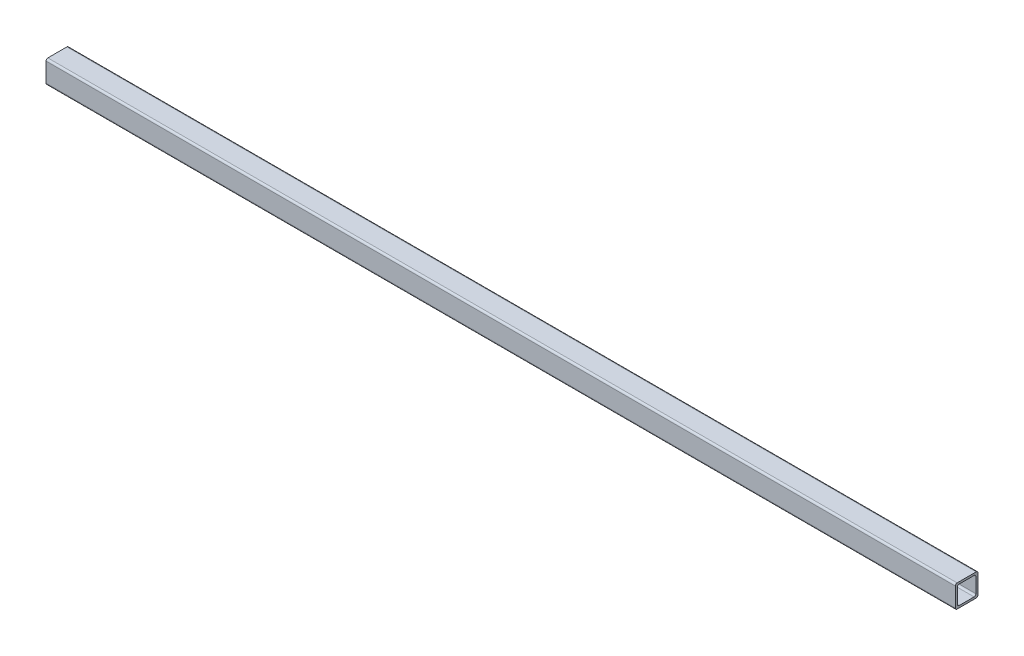
ISO-10303-21;
HEADER;
FILE_DESCRIPTION(('STEP AP214'),'2;1');
FILE_NAME('part.step','',(''),(''),'','','');
FILE_SCHEMA(('AUTOMOTIVE_DESIGN { 1 0 10303 214 1 1 1 1 }'));
ENDSEC;
DATA;
#1=APPLICATION_CONTEXT('core data for automotive mechanical design processes');
#2=APPLICATION_PROTOCOL_DEFINITION('international standard','automotive_design',2000,#1);
#3=PRODUCT_CONTEXT('',#1,'mechanical');
#4=PRODUCT('Part','Part','',(#3));
#5=PRODUCT_RELATED_PRODUCT_CATEGORY('part','',(#4));
#6=PRODUCT_DEFINITION_FORMATION('','',#4);
#7=PRODUCT_DEFINITION_CONTEXT('part definition',#1,'design');
#8=PRODUCT_DEFINITION('design','',#6,#7);
#9=PRODUCT_DEFINITION_SHAPE('','',#8);
#10=(LENGTH_UNIT() NAMED_UNIT(*) SI_UNIT(.MILLI.,.METRE.));
#11=(NAMED_UNIT(*) PLANE_ANGLE_UNIT() SI_UNIT($,.RADIAN.));
#12=(NAMED_UNIT(*) SI_UNIT($,.STERADIAN.) SOLID_ANGLE_UNIT());
#13=UNCERTAINTY_MEASURE_WITH_UNIT(LENGTH_MEASURE(1.E-05),#10,'distance_accuracy_value','');
#14=(GEOMETRIC_REPRESENTATION_CONTEXT(3) GLOBAL_UNCERTAINTY_ASSIGNED_CONTEXT((#13)) GLOBAL_UNIT_ASSIGNED_CONTEXT((#10,
#11,#12)) REPRESENTATION_CONTEXT('',''));
#15=CARTESIAN_POINT('',(0.,0.,0.));
#16=DIRECTION('',(0.,0.,1.));
#17=DIRECTION('',(1.,0.,0.));
#18=AXIS2_PLACEMENT_3D('',#15,#16,#17);
#19=CARTESIAN_POINT('',(500.,25.,12.5));
#20=DIRECTION('',(0.,0.,-1.));
#21=DIRECTION('',(0.,1.,0.));
#22=AXIS2_PLACEMENT_3D('',#19,#20,#21);
#23=PLANE('',#22);
#24=DIRECTION('',(0.,-1.,0.));
#25=VECTOR('',#24,1.);
#26=CARTESIAN_POINT('',(-500.,25.,12.5));
#27=LINE('',#26,#25);
#28=CARTESIAN_POINT('',(-500.,23.,12.5));
#29=VERTEX_POINT('',#28);
#30=CARTESIAN_POINT('',(-500.,2.,12.5));
#31=VERTEX_POINT('',#30);
#32=EDGE_CURVE('E180',#29,#31,#27,.T.);
#33=ORIENTED_EDGE('',*,*,#32,.T.);
#34=DIRECTION('',(-1.,0.,0.));
#35=VECTOR('',#34,1.);
#36=CARTESIAN_POINT('',(500.,2.,12.5));
#37=LINE('',#36,#35);
#38=CARTESIAN_POINT('',(500.,2.,12.5));
#39=VERTEX_POINT('',#38);
#40=EDGE_CURVE('E158',#31,#39,#37,.F.);
#41=ORIENTED_EDGE('',*,*,#40,.T.);
#42=DIRECTION('',(0.,-1.,0.));
#43=VECTOR('',#42,1.);
#44=CARTESIAN_POINT('',(500.,25.,12.5));
#45=LINE('',#44,#43);
#46=CARTESIAN_POINT('',(500.,23.,12.5));
#47=VERTEX_POINT('',#46);
#48=EDGE_CURVE('E191',#47,#39,#45,.T.);
#49=ORIENTED_EDGE('',*,*,#48,.F.);
#50=DIRECTION('',(-1.,0.,0.));
#51=VECTOR('',#50,1.);
#52=CARTESIAN_POINT('',(500.,23.,12.5));
#53=LINE('',#52,#51);
#54=EDGE_CURVE('E163',#47,#29,#53,.T.);
#55=ORIENTED_EDGE('',*,*,#54,.T.);
#56=EDGE_LOOP('',(#33,#41,#49,#55));
#57=FACE_BOUND('',#56,.T.);
#58=ADVANCED_FACE('F39',(#57),#23,.F.);
#59=CARTESIAN_POINT('',(500.,0.,12.5));
#60=DIRECTION('',(0.,1.,0.));
#61=DIRECTION('',(0.,0.,1.));
#62=AXIS2_PLACEMENT_3D('',#59,#60,#61);
#63=PLANE('',#62);
#64=DIRECTION('',(0.,0.,-1.));
#65=VECTOR('',#64,1.);
#66=CARTESIAN_POINT('',(500.,0.,12.5));
#67=LINE('',#66,#65);
#68=CARTESIAN_POINT('',(500.,0.,10.5));
#69=VERTEX_POINT('',#68);
#70=CARTESIAN_POINT('',(500.,0.,-10.5));
#71=VERTEX_POINT('',#70);
#72=EDGE_CURVE('E173',#69,#71,#67,.T.);
#73=ORIENTED_EDGE('',*,*,#72,.F.);
#74=DIRECTION('',(-1.,0.,0.));
#75=VECTOR('',#74,1.);
#76=CARTESIAN_POINT('',(500.,0.,10.5));
#77=LINE('',#76,#75);
#78=CARTESIAN_POINT('',(-500.,0.,10.5));
#79=VERTEX_POINT('',#78);
#80=EDGE_CURVE('E157',#69,#79,#77,.T.);
#81=ORIENTED_EDGE('',*,*,#80,.T.);
#82=DIRECTION('',(0.,0.,-1.));
#83=VECTOR('',#82,1.);
#84=CARTESIAN_POINT('',(-500.,0.,12.5));
#85=LINE('',#84,#83);
#86=CARTESIAN_POINT('',(-500.,0.,-10.5));
#87=VERTEX_POINT('',#86);
#88=EDGE_CURVE('E170',#79,#87,#85,.T.);
#89=ORIENTED_EDGE('',*,*,#88,.T.);
#90=DIRECTION('',(-1.,0.,0.));
#91=VECTOR('',#90,1.);
#92=CARTESIAN_POINT('',(500.,0.,-10.5));
#93=LINE('',#92,#91);
#94=EDGE_CURVE('E175',#87,#71,#93,.F.);
#95=ORIENTED_EDGE('',*,*,#94,.T.);
#96=EDGE_LOOP('',(#73,#81,#89,#95));
#97=FACE_BOUND('',#96,.T.);
#98=ADVANCED_FACE('F169',(#97),#63,.F.);
#99=CARTESIAN_POINT('',(500.,25.,-12.5));
#100=DIRECTION('',(0.,0.,1.));
#101=DIRECTION('',(0.,-1.,0.));
#102=AXIS2_PLACEMENT_3D('',#99,#100,#101);
#103=PLANE('',#102);
#104=DIRECTION('',(0.,1.,0.));
#105=VECTOR('',#104,1.);
#106=CARTESIAN_POINT('',(500.,25.,-12.5));
#107=LINE('',#106,#105);
#108=CARTESIAN_POINT('',(500.,2.,-12.5));
#109=VERTEX_POINT('',#108);
#110=CARTESIAN_POINT('',(500.,23.,-12.5));
#111=VERTEX_POINT('',#110);
#112=EDGE_CURVE('E287',#109,#111,#107,.T.);
#113=ORIENTED_EDGE('',*,*,#112,.F.);
#114=DIRECTION('',(-1.,0.,0.));
#115=VECTOR('',#114,1.);
#116=CARTESIAN_POINT('',(500.,2.,-12.5));
#117=LINE('',#116,#115);
#118=CARTESIAN_POINT('',(-500.,2.,-12.5));
#119=VERTEX_POINT('',#118);
#120=EDGE_CURVE('E211',#109,#119,#117,.T.);
#121=ORIENTED_EDGE('',*,*,#120,.T.);
#122=DIRECTION('',(0.,1.,0.));
#123=VECTOR('',#122,1.);
#124=CARTESIAN_POINT('',(-500.,25.,-12.5));
#125=LINE('',#124,#123);
#126=CARTESIAN_POINT('',(-500.,23.,-12.5));
#127=VERTEX_POINT('',#126);
#128=EDGE_CURVE('E179',#119,#127,#125,.T.);
#129=ORIENTED_EDGE('',*,*,#128,.T.);
#130=DIRECTION('',(-1.,0.,0.));
#131=VECTOR('',#130,1.);
#132=CARTESIAN_POINT('',(500.,23.,-12.5));
#133=LINE('',#132,#131);
#134=EDGE_CURVE('E209',#127,#111,#133,.F.);
#135=ORIENTED_EDGE('',*,*,#134,.T.);
#136=EDGE_LOOP('',(#113,#121,#129,#135));
#137=FACE_BOUND('',#136,.T.);
#138=ADVANCED_FACE('F308',(#137),#103,.F.);
#139=CARTESIAN_POINT('',(500.,25.,12.5));
#140=DIRECTION('',(0.,-1.,0.));
#141=DIRECTION('',(0.,0.,-1.));
#142=AXIS2_PLACEMENT_3D('',#139,#140,#141);
#143=PLANE('',#142);
#144=DIRECTION('',(0.,0.,1.));
#145=VECTOR('',#144,1.);
#146=CARTESIAN_POINT('',(500.,25.,12.5));
#147=LINE('',#146,#145);
#148=CARTESIAN_POINT('',(500.,25.,-10.5));
#149=VERTEX_POINT('',#148);
#150=CARTESIAN_POINT('',(500.,25.,10.5));
#151=VERTEX_POINT('',#150);
#152=EDGE_CURVE('E192',#149,#151,#147,.T.);
#153=ORIENTED_EDGE('',*,*,#152,.F.);
#154=DIRECTION('',(-1.,0.,0.));
#155=VECTOR('',#154,1.);
#156=CARTESIAN_POINT('',(500.,25.,-10.5));
#157=LINE('',#156,#155);
#158=CARTESIAN_POINT('',(-500.,25.,-10.5));
#159=VERTEX_POINT('',#158);
#160=EDGE_CURVE('E216',#149,#159,#157,.T.);
#161=ORIENTED_EDGE('',*,*,#160,.T.);
#162=DIRECTION('',(0.,0.,1.));
#163=VECTOR('',#162,1.);
#164=CARTESIAN_POINT('',(-500.,25.,12.5));
#165=LINE('',#164,#163);
#166=CARTESIAN_POINT('',(-500.,25.,10.5));
#167=VERTEX_POINT('',#166);
#168=EDGE_CURVE('E183',#159,#167,#165,.T.);
#169=ORIENTED_EDGE('',*,*,#168,.T.);
#170=DIRECTION('',(-1.,0.,0.));
#171=VECTOR('',#170,1.);
#172=CARTESIAN_POINT('',(500.,25.,10.5));
#173=LINE('',#172,#171);
#174=EDGE_CURVE('E214',#167,#151,#173,.F.);
#175=ORIENTED_EDGE('',*,*,#174,.T.);
#176=EDGE_LOOP('',(#153,#161,#169,#175));
#177=FACE_BOUND('',#176,.T.);
#178=ADVANCED_FACE('F302',(#177),#143,.F.);
#179=CARTESIAN_POINT('',(500.,0.,0.));
#180=DIRECTION('',(1.,0.,0.));
#181=DIRECTION('',(0.,0.,-1.));
#182=AXIS2_PLACEMENT_3D('',#179,#180,#181);
#183=PLANE('',#182);
#184=DIRECTION('',(0.,0.,1.));
#185=VECTOR('',#184,1.);
#186=CARTESIAN_POINT('',(500.,22.7,0.));
#187=LINE('',#186,#185);
#188=CARTESIAN_POINT('',(500.,22.7,-8.2));
#189=VERTEX_POINT('',#188);
#190=CARTESIAN_POINT('',(500.,22.7,8.19999999999999));
#191=VERTEX_POINT('',#190);
#192=EDGE_CURVE('E185',#189,#191,#187,.T.);
#193=ORIENTED_EDGE('',*,*,#192,.F.);
#194=CARTESIAN_POINT('',(500.,20.7,-8.2));
#195=DIRECTION('',(1.,0.,0.));
#196=DIRECTION('',(0.,0.,-1.));
#197=AXIS2_PLACEMENT_3D('',#194,#195,#196);
#198=CIRCLE('',#197,2.);
#199=CARTESIAN_POINT('',(500.,20.7,-10.2));
#200=VERTEX_POINT('',#199);
#201=EDGE_CURVE('E47',#189,#200,#198,.F.);
#202=ORIENTED_EDGE('',*,*,#201,.T.);
#203=DIRECTION('',(0.,1.,0.));
#204=VECTOR('',#203,1.);
#205=CARTESIAN_POINT('',(500.,0.,-10.2));
#206=LINE('',#205,#204);
#207=CARTESIAN_POINT('',(500.,4.3,-10.2));
#208=VERTEX_POINT('',#207);
#209=EDGE_CURVE('E253',#208,#200,#206,.T.);
#210=ORIENTED_EDGE('',*,*,#209,.F.);
#211=CARTESIAN_POINT('',(500.,4.3,-8.2));
#212=DIRECTION('',(1.,0.,0.));
#213=DIRECTION('',(0.,0.,-1.));
#214=AXIS2_PLACEMENT_3D('',#211,#212,#213);
#215=CIRCLE('',#214,2.);
#216=CARTESIAN_POINT('',(500.,2.3,-8.2));
#217=VERTEX_POINT('',#216);
#218=EDGE_CURVE('E246',#208,#217,#215,.F.);
#219=ORIENTED_EDGE('',*,*,#218,.T.);
#220=DIRECTION('',(0.,0.,-1.));
#221=VECTOR('',#220,1.);
#222=CARTESIAN_POINT('',(500.,2.3,0.));
#223=LINE('',#222,#221);
#224=CARTESIAN_POINT('',(500.,2.3,8.2));
#225=VERTEX_POINT('',#224);
#226=EDGE_CURVE('E259',#225,#217,#223,.T.);
#227=ORIENTED_EDGE('',*,*,#226,.F.);
#228=CARTESIAN_POINT('',(500.,4.3,8.2));
#229=DIRECTION('',(1.,0.,0.));
#230=DIRECTION('',(0.,0.,-1.));
#231=AXIS2_PLACEMENT_3D('',#228,#229,#230);
#232=CIRCLE('',#231,2.);
#233=CARTESIAN_POINT('',(500.,4.3,10.2));
#234=VERTEX_POINT('',#233);
#235=EDGE_CURVE('E238',#225,#234,#232,.F.);
#236=ORIENTED_EDGE('',*,*,#235,.T.);
#237=DIRECTION('',(0.,-1.,0.));
#238=VECTOR('',#237,1.);
#239=CARTESIAN_POINT('',(500.,0.,10.2));
#240=LINE('',#239,#238);
#241=CARTESIAN_POINT('',(500.,20.7,10.2));
#242=VERTEX_POINT('',#241);
#243=EDGE_CURVE('E278',#242,#234,#240,.T.);
#244=ORIENTED_EDGE('',*,*,#243,.F.);
#245=CARTESIAN_POINT('',(500.,20.7,8.19999999999999));
#246=DIRECTION('',(1.,0.,0.));
#247=DIRECTION('',(0.,0.,-1.));
#248=AXIS2_PLACEMENT_3D('',#245,#246,#247);
#249=CIRCLE('',#248,2.);
#250=EDGE_CURVE('E242',#242,#191,#249,.F.);
#251=ORIENTED_EDGE('',*,*,#250,.T.);
#252=EDGE_LOOP('',(#193,#202,#210,#219,#227,#236,#244,#251));
#253=FACE_BOUND('',#252,.T.);
#254=ORIENTED_EDGE('',*,*,#48,.T.);
#255=CARTESIAN_POINT('',(500.,2.,10.5));
#256=DIRECTION('',(1.,0.,0.));
#257=DIRECTION('',(0.,0.,-1.));
#258=AXIS2_PLACEMENT_3D('',#255,#256,#257);
#259=CIRCLE('',#258,2.);
#260=EDGE_CURVE('E207',#39,#69,#259,.T.);
#261=ORIENTED_EDGE('',*,*,#260,.T.);
#262=ORIENTED_EDGE('',*,*,#72,.T.);
#263=CARTESIAN_POINT('',(500.,2.,-10.5));
#264=DIRECTION('',(1.,0.,0.));
#265=DIRECTION('',(0.,0.,-1.));
#266=AXIS2_PLACEMENT_3D('',#263,#264,#265);
#267=CIRCLE('',#266,2.);
#268=EDGE_CURVE('E205',#71,#109,#267,.T.);
#269=ORIENTED_EDGE('',*,*,#268,.T.);
#270=ORIENTED_EDGE('',*,*,#112,.T.);
#271=CARTESIAN_POINT('',(500.,23.,-10.5));
#272=DIRECTION('',(1.,0.,0.));
#273=DIRECTION('',(0.,0.,-1.));
#274=AXIS2_PLACEMENT_3D('',#271,#272,#273);
#275=CIRCLE('',#274,2.);
#276=EDGE_CURVE('E203',#111,#149,#275,.T.);
#277=ORIENTED_EDGE('',*,*,#276,.T.);
#278=ORIENTED_EDGE('',*,*,#152,.T.);
#279=CARTESIAN_POINT('',(500.,23.,10.5));
#280=DIRECTION('',(1.,0.,0.));
#281=DIRECTION('',(0.,0.,-1.));
#282=AXIS2_PLACEMENT_3D('',#279,#280,#281);
#283=CIRCLE('',#282,2.);
#284=EDGE_CURVE('E201',#151,#47,#283,.T.);
#285=ORIENTED_EDGE('',*,*,#284,.T.);
#286=EDGE_LOOP('',(#254,#261,#262,#269,#270,#277,#278,#285));
#287=FACE_BOUND('',#286,.T.);
#288=ADVANCED_FACE('F251',(#253,#287),#183,.T.);
#289=CARTESIAN_POINT('',(-500.,0.,0.));
#290=DIRECTION('',(1.,0.,0.));
#291=DIRECTION('',(0.,0.,-1.));
#292=AXIS2_PLACEMENT_3D('',#289,#290,#291);
#293=PLANE('',#292);
#294=DIRECTION('',(0.,0.,-1.));
#295=VECTOR('',#294,1.);
#296=CARTESIAN_POINT('',(-500.,2.3,10.2));
#297=LINE('',#296,#295);
#298=CARTESIAN_POINT('',(-500.,2.3,8.2));
#299=VERTEX_POINT('',#298);
#300=CARTESIAN_POINT('',(-500.,2.3,-8.2));
#301=VERTEX_POINT('',#300);
#302=EDGE_CURVE('E273',#299,#301,#297,.T.);
#303=ORIENTED_EDGE('',*,*,#302,.T.);
#304=CARTESIAN_POINT('',(-500.,4.3,-8.2));
#305=DIRECTION('',(1.,0.,0.));
#306=DIRECTION('',(0.,0.,-1.));
#307=AXIS2_PLACEMENT_3D('',#304,#305,#306);
#308=CIRCLE('',#307,2.);
#309=CARTESIAN_POINT('',(-500.,4.3,-10.2));
#310=VERTEX_POINT('',#309);
#311=EDGE_CURVE('E61',#301,#310,#308,.T.);
#312=ORIENTED_EDGE('',*,*,#311,.T.);
#313=DIRECTION('',(0.,1.,0.));
#314=VECTOR('',#313,1.);
#315=CARTESIAN_POINT('',(-500.,2.3,-10.2));
#316=LINE('',#315,#314);
#317=CARTESIAN_POINT('',(-500.,20.7,-10.2));
#318=VERTEX_POINT('',#317);
#319=EDGE_CURVE('E266',#310,#318,#316,.T.);
#320=ORIENTED_EDGE('',*,*,#319,.T.);
#321=CARTESIAN_POINT('',(-500.,20.7,-8.2));
#322=DIRECTION('',(1.,0.,0.));
#323=DIRECTION('',(0.,0.,-1.));
#324=AXIS2_PLACEMENT_3D('',#321,#322,#323);
#325=CIRCLE('',#324,2.);
#326=CARTESIAN_POINT('',(-500.,22.7,-8.2));
#327=VERTEX_POINT('',#326);
#328=EDGE_CURVE('E11',#318,#327,#325,.T.);
#329=ORIENTED_EDGE('',*,*,#328,.T.);
#330=DIRECTION('',(0.,0.,1.));
#331=VECTOR('',#330,1.);
#332=CARTESIAN_POINT('',(-500.,22.7,-10.2));
#333=LINE('',#332,#331);
#334=CARTESIAN_POINT('',(-500.,22.7,8.19999999999999));
#335=VERTEX_POINT('',#334);
#336=EDGE_CURVE('E264',#327,#335,#333,.T.);
#337=ORIENTED_EDGE('',*,*,#336,.T.);
#338=CARTESIAN_POINT('',(-500.,20.7,8.19999999999999));
#339=DIRECTION('',(1.,0.,0.));
#340=DIRECTION('',(0.,0.,-1.));
#341=AXIS2_PLACEMENT_3D('',#338,#339,#340);
#342=CIRCLE('',#341,2.);
#343=CARTESIAN_POINT('',(-500.,20.7,10.2));
#344=VERTEX_POINT('',#343);
#345=EDGE_CURVE('E244',#335,#344,#342,.T.);
#346=ORIENTED_EDGE('',*,*,#345,.T.);
#347=DIRECTION('',(0.,-1.,0.));
#348=VECTOR('',#347,1.);
#349=CARTESIAN_POINT('',(-500.,22.7,10.2));
#350=LINE('',#349,#348);
#351=CARTESIAN_POINT('',(-500.,4.3,10.2));
#352=VERTEX_POINT('',#351);
#353=EDGE_CURVE('E270',#344,#352,#350,.T.);
#354=ORIENTED_EDGE('',*,*,#353,.T.);
#355=CARTESIAN_POINT('',(-500.,4.3,8.2));
#356=DIRECTION('',(1.,0.,0.));
#357=DIRECTION('',(0.,0.,-1.));
#358=AXIS2_PLACEMENT_3D('',#355,#356,#357);
#359=CIRCLE('',#358,2.);
#360=EDGE_CURVE('E240',#352,#299,#359,.T.);
#361=ORIENTED_EDGE('',*,*,#360,.T.);
#362=EDGE_LOOP('',(#303,#312,#320,#329,#337,#346,#354,#361));
#363=FACE_BOUND('',#362,.T.);
#364=ORIENTED_EDGE('',*,*,#88,.F.);
#365=CARTESIAN_POINT('',(-500.,2.,10.5));
#366=DIRECTION('',(1.,0.,0.));
#367=DIRECTION('',(0.,0.,-1.));
#368=AXIS2_PLACEMENT_3D('',#365,#366,#367);
#369=CIRCLE('',#368,2.);
#370=EDGE_CURVE('E153',#79,#31,#369,.F.);
#371=ORIENTED_EDGE('',*,*,#370,.T.);
#372=ORIENTED_EDGE('',*,*,#32,.F.);
#373=CARTESIAN_POINT('',(-500.,23.,10.5));
#374=DIRECTION('',(1.,0.,0.));
#375=DIRECTION('',(0.,0.,-1.));
#376=AXIS2_PLACEMENT_3D('',#373,#374,#375);
#377=CIRCLE('',#376,2.);
#378=EDGE_CURVE('E174',#29,#167,#377,.F.);
#379=ORIENTED_EDGE('',*,*,#378,.T.);
#380=ORIENTED_EDGE('',*,*,#168,.F.);
#381=CARTESIAN_POINT('',(-500.,23.,-10.5));
#382=DIRECTION('',(1.,0.,0.));
#383=DIRECTION('',(0.,0.,-1.));
#384=AXIS2_PLACEMENT_3D('',#381,#382,#383);
#385=CIRCLE('',#384,2.);
#386=EDGE_CURVE('E195',#159,#127,#385,.F.);
#387=ORIENTED_EDGE('',*,*,#386,.T.);
#388=ORIENTED_EDGE('',*,*,#128,.F.);
#389=CARTESIAN_POINT('',(-500.,2.,-10.5));
#390=DIRECTION('',(1.,0.,0.));
#391=DIRECTION('',(0.,0.,-1.));
#392=AXIS2_PLACEMENT_3D('',#389,#390,#391);
#393=CIRCLE('',#392,2.);
#394=EDGE_CURVE('E164',#119,#87,#393,.F.);
#395=ORIENTED_EDGE('',*,*,#394,.T.);
#396=EDGE_LOOP('',(#364,#371,#372,#379,#380,#387,#388,#395));
#397=FACE_BOUND('',#396,.T.);
#398=ADVANCED_FACE('F177',(#363,#397),#293,.F.);
#399=CARTESIAN_POINT('',(500.,2.,10.5));
#400=DIRECTION('',(-1.,0.,0.));
#401=DIRECTION('',(0.,0.,1.));
#402=AXIS2_PLACEMENT_3D('',#399,#400,#401);
#403=CYLINDRICAL_SURFACE('',#402,2.);
#404=ORIENTED_EDGE('',*,*,#260,.F.);
#405=ORIENTED_EDGE('',*,*,#40,.F.);
#406=ORIENTED_EDGE('',*,*,#370,.F.);
#407=ORIENTED_EDGE('',*,*,#80,.F.);
#408=EDGE_LOOP('',(#404,#405,#406,#407));
#409=FACE_BOUND('',#408,.T.);
#410=ADVANCED_FACE('F156',(#409),#403,.T.);
#411=CARTESIAN_POINT('',(500.,2.,-10.5));
#412=DIRECTION('',(-1.,0.,0.));
#413=DIRECTION('',(0.,0.,1.));
#414=AXIS2_PLACEMENT_3D('',#411,#412,#413);
#415=CYLINDRICAL_SURFACE('',#414,2.);
#416=ORIENTED_EDGE('',*,*,#268,.F.);
#417=ORIENTED_EDGE('',*,*,#94,.F.);
#418=ORIENTED_EDGE('',*,*,#394,.F.);
#419=ORIENTED_EDGE('',*,*,#120,.F.);
#420=EDGE_LOOP('',(#416,#417,#418,#419));
#421=FACE_BOUND('',#420,.T.);
#422=ADVANCED_FACE('F312',(#421),#415,.T.);
#423=CARTESIAN_POINT('',(500.,23.,-10.5));
#424=DIRECTION('',(-1.,0.,0.));
#425=DIRECTION('',(0.,0.,1.));
#426=AXIS2_PLACEMENT_3D('',#423,#424,#425);
#427=CYLINDRICAL_SURFACE('',#426,2.);
#428=ORIENTED_EDGE('',*,*,#276,.F.);
#429=ORIENTED_EDGE('',*,*,#134,.F.);
#430=ORIENTED_EDGE('',*,*,#386,.F.);
#431=ORIENTED_EDGE('',*,*,#160,.F.);
#432=EDGE_LOOP('',(#428,#429,#430,#431));
#433=FACE_BOUND('',#432,.T.);
#434=ADVANCED_FACE('F304',(#433),#427,.T.);
#435=CARTESIAN_POINT('',(500.,23.,10.5));
#436=DIRECTION('',(-1.,0.,0.));
#437=DIRECTION('',(0.,0.,1.));
#438=AXIS2_PLACEMENT_3D('',#435,#436,#437);
#439=CYLINDRICAL_SURFACE('',#438,2.);
#440=ORIENTED_EDGE('',*,*,#284,.F.);
#441=ORIENTED_EDGE('',*,*,#174,.F.);
#442=ORIENTED_EDGE('',*,*,#378,.F.);
#443=ORIENTED_EDGE('',*,*,#54,.F.);
#444=EDGE_LOOP('',(#440,#441,#442,#443));
#445=FACE_BOUND('',#444,.T.);
#446=ADVANCED_FACE('F299',(#445),#439,.T.);
#447=CARTESIAN_POINT('',(-500.,22.7,-10.2));
#448=DIRECTION('',(0.,1.,0.));
#449=DIRECTION('',(0.,0.,1.));
#450=AXIS2_PLACEMENT_3D('',#447,#448,#449);
#451=PLANE('',#450);
#452=ORIENTED_EDGE('',*,*,#192,.T.);
#453=DIRECTION('',(1.,0.,0.));
#454=VECTOR('',#453,1.);
#455=CARTESIAN_POINT('',(-500.,22.7,8.19999999999999));
#456=LINE('',#455,#454);
#457=EDGE_CURVE('E232',#191,#335,#456,.F.);
#458=ORIENTED_EDGE('',*,*,#457,.T.);
#459=ORIENTED_EDGE('',*,*,#336,.F.);
#460=DIRECTION('',(1.,0.,0.));
#461=VECTOR('',#460,1.);
#462=CARTESIAN_POINT('',(500.,22.7,-8.2));
#463=LINE('',#462,#461);
#464=EDGE_CURVE('E229',#327,#189,#463,.T.);
#465=ORIENTED_EDGE('',*,*,#464,.T.);
#466=EDGE_LOOP('',(#452,#458,#459,#465));
#467=FACE_BOUND('',#466,.T.);
#468=ADVANCED_FACE('F268',(#467),#451,.F.);
#469=CARTESIAN_POINT('',(-500.,2.3,-10.2));
#470=DIRECTION('',(0.,0.,-1.));
#471=DIRECTION('',(0.,1.,0.));
#472=AXIS2_PLACEMENT_3D('',#469,#470,#471);
#473=PLANE('',#472);
#474=ORIENTED_EDGE('',*,*,#319,.F.);
#475=DIRECTION('',(1.,0.,0.));
#476=VECTOR('',#475,1.);
#477=CARTESIAN_POINT('',(500.,4.3,-10.2));
#478=LINE('',#477,#476);
#479=EDGE_CURVE('E235',#310,#208,#478,.T.);
#480=ORIENTED_EDGE('',*,*,#479,.T.);
#481=ORIENTED_EDGE('',*,*,#209,.T.);
#482=DIRECTION('',(1.,0.,0.));
#483=VECTOR('',#482,1.);
#484=CARTESIAN_POINT('',(-500.,20.7,-10.2));
#485=LINE('',#484,#483);
#486=EDGE_CURVE('E54',#200,#318,#485,.F.);
#487=ORIENTED_EDGE('',*,*,#486,.T.);
#488=EDGE_LOOP('',(#474,#480,#481,#487));
#489=FACE_BOUND('',#488,.T.);
#490=ADVANCED_FACE('F257',(#489),#473,.F.);
#491=CARTESIAN_POINT('',(-500.,2.3,10.2));
#492=DIRECTION('',(0.,-1.,0.));
#493=DIRECTION('',(0.,0.,-1.));
#494=AXIS2_PLACEMENT_3D('',#491,#492,#493);
#495=PLANE('',#494);
#496=ORIENTED_EDGE('',*,*,#302,.F.);
#497=DIRECTION('',(1.,0.,0.));
#498=VECTOR('',#497,1.);
#499=CARTESIAN_POINT('',(500.,2.3,8.2));
#500=LINE('',#499,#498);
#501=EDGE_CURVE('E221',#299,#225,#500,.T.);
#502=ORIENTED_EDGE('',*,*,#501,.T.);
#503=ORIENTED_EDGE('',*,*,#226,.T.);
#504=DIRECTION('',(1.,0.,0.));
#505=VECTOR('',#504,1.);
#506=CARTESIAN_POINT('',(-500.,2.3,-8.2));
#507=LINE('',#506,#505);
#508=EDGE_CURVE('E219',#217,#301,#507,.F.);
#509=ORIENTED_EDGE('',*,*,#508,.T.);
#510=EDGE_LOOP('',(#496,#502,#503,#509));
#511=FACE_BOUND('',#510,.T.);
#512=ADVANCED_FACE('F342',(#511),#495,.F.);
#513=CARTESIAN_POINT('',(-500.,22.7,10.2));
#514=DIRECTION('',(0.,0.,1.));
#515=DIRECTION('',(0.,-1.,0.));
#516=AXIS2_PLACEMENT_3D('',#513,#514,#515);
#517=PLANE('',#516);
#518=ORIENTED_EDGE('',*,*,#243,.T.);
#519=DIRECTION('',(1.,0.,0.));
#520=VECTOR('',#519,1.);
#521=CARTESIAN_POINT('',(-500.,4.3,10.2));
#522=LINE('',#521,#520);
#523=EDGE_CURVE('E227',#234,#352,#522,.F.);
#524=ORIENTED_EDGE('',*,*,#523,.T.);
#525=ORIENTED_EDGE('',*,*,#353,.F.);
#526=DIRECTION('',(1.,0.,0.));
#527=VECTOR('',#526,1.);
#528=CARTESIAN_POINT('',(500.,20.7,10.2));
#529=LINE('',#528,#527);
#530=EDGE_CURVE('E224',#344,#242,#529,.T.);
#531=ORIENTED_EDGE('',*,*,#530,.T.);
#532=EDGE_LOOP('',(#518,#524,#525,#531));
#533=FACE_BOUND('',#532,.T.);
#534=ADVANCED_FACE('F338',(#533),#517,.F.);
#535=CARTESIAN_POINT('',(-500.,4.3,8.2));
#536=DIRECTION('',(-1.,0.,0.));
#537=DIRECTION('',(0.,0.,1.));
#538=AXIS2_PLACEMENT_3D('',#535,#536,#537);
#539=CYLINDRICAL_SURFACE('',#538,2.);
#540=ORIENTED_EDGE('',*,*,#360,.F.);
#541=ORIENTED_EDGE('',*,*,#523,.F.);
#542=ORIENTED_EDGE('',*,*,#235,.F.);
#543=ORIENTED_EDGE('',*,*,#501,.F.);
#544=EDGE_LOOP('',(#540,#541,#542,#543));
#545=FACE_BOUND('',#544,.T.);
#546=ADVANCED_FACE('F341',(#545),#539,.F.);
#547=CARTESIAN_POINT('',(-500.,20.7,8.19999999999999));
#548=DIRECTION('',(-1.,0.,0.));
#549=DIRECTION('',(0.,0.,1.));
#550=AXIS2_PLACEMENT_3D('',#547,#548,#549);
#551=CYLINDRICAL_SURFACE('',#550,2.);
#552=ORIENTED_EDGE('',*,*,#345,.F.);
#553=ORIENTED_EDGE('',*,*,#457,.F.);
#554=ORIENTED_EDGE('',*,*,#250,.F.);
#555=ORIENTED_EDGE('',*,*,#530,.F.);
#556=EDGE_LOOP('',(#552,#553,#554,#555));
#557=FACE_BOUND('',#556,.T.);
#558=ADVANCED_FACE('F367',(#557),#551,.F.);
#559=CARTESIAN_POINT('',(-500.,4.3,-8.2));
#560=DIRECTION('',(-1.,0.,0.));
#561=DIRECTION('',(0.,0.,1.));
#562=AXIS2_PLACEMENT_3D('',#559,#560,#561);
#563=CYLINDRICAL_SURFACE('',#562,2.);
#564=ORIENTED_EDGE('',*,*,#311,.F.);
#565=ORIENTED_EDGE('',*,*,#508,.F.);
#566=ORIENTED_EDGE('',*,*,#218,.F.);
#567=ORIENTED_EDGE('',*,*,#479,.F.);
#568=EDGE_LOOP('',(#564,#565,#566,#567));
#569=FACE_BOUND('',#568,.T.);
#570=ADVANCED_FACE('F375',(#569),#563,.F.);
#571=CARTESIAN_POINT('',(-500.,20.7,-8.2));
#572=DIRECTION('',(-1.,0.,0.));
#573=DIRECTION('',(0.,0.,1.));
#574=AXIS2_PLACEMENT_3D('',#571,#572,#573);
#575=CYLINDRICAL_SURFACE('',#574,2.);
#576=ORIENTED_EDGE('',*,*,#328,.F.);
#577=ORIENTED_EDGE('',*,*,#486,.F.);
#578=ORIENTED_EDGE('',*,*,#201,.F.);
#579=ORIENTED_EDGE('',*,*,#464,.F.);
#580=EDGE_LOOP('',(#576,#577,#578,#579));
#581=FACE_BOUND('',#580,.T.);
#582=ADVANCED_FACE('F41',(#581),#575,.F.);
#583=CLOSED_SHELL('',(#58,#98,#138,#178,#288,#398,#410,#422,#434,#446,#468,#490,#512,#534,#546,
#558,#570,#582));
#584=MANIFOLD_SOLID_BREP('B2',#583);
#585=ADVANCED_BREP_SHAPE_REPRESENTATION('',(#18,#584),#14);
#586=SHAPE_DEFINITION_REPRESENTATION(#9,#585);
ENDSEC;
END-ISO-10303-21;
